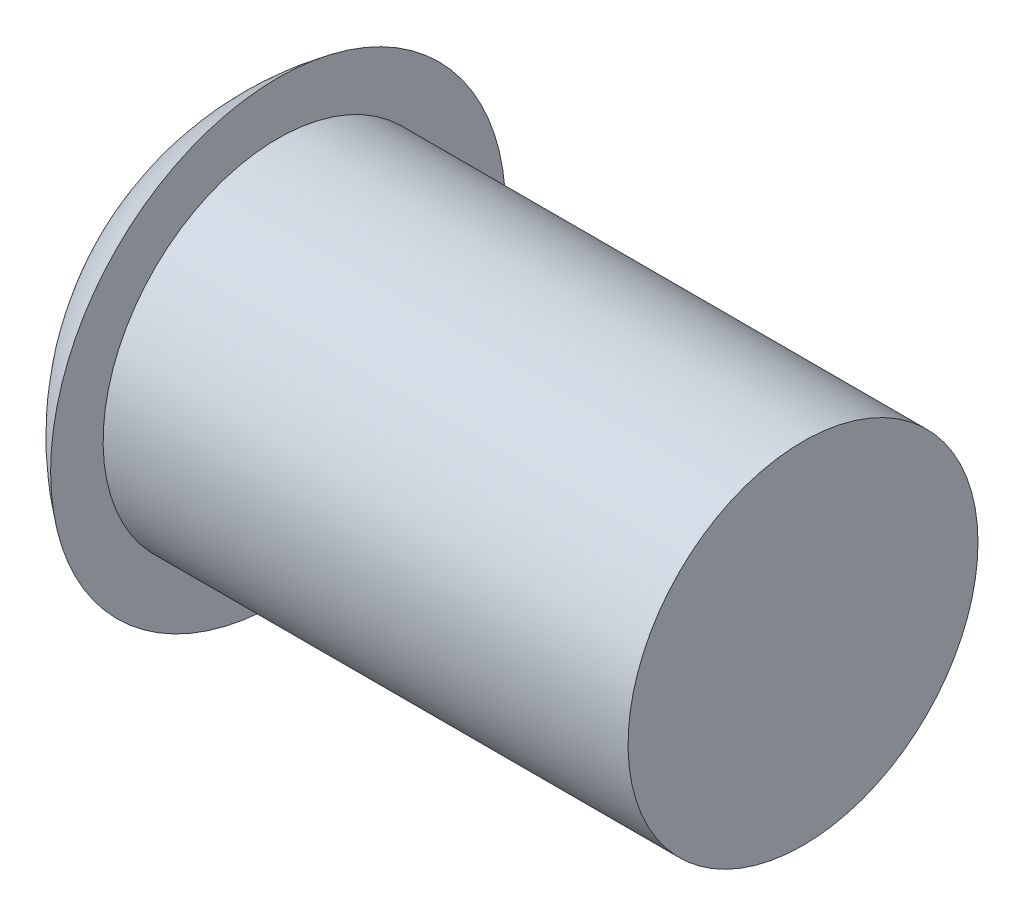
ISO-10303-21;
HEADER;
FILE_DESCRIPTION(('STEP AP214'),'2;1');
FILE_NAME('part.step','',(''),(''),'','','');
FILE_SCHEMA(('AUTOMOTIVE_DESIGN { 1 0 10303 214 1 1 1 1 }'));
ENDSEC;
DATA;
#1=APPLICATION_CONTEXT('core data for automotive mechanical design processes');
#2=APPLICATION_PROTOCOL_DEFINITION('international standard','automotive_design',2000,#1);
#3=PRODUCT_CONTEXT('',#1,'mechanical');
#4=PRODUCT('Part','Part','',(#3));
#5=PRODUCT_RELATED_PRODUCT_CATEGORY('part','',(#4));
#6=PRODUCT_DEFINITION_FORMATION('','',#4);
#7=PRODUCT_DEFINITION_CONTEXT('part definition',#1,'design');
#8=PRODUCT_DEFINITION('design','',#6,#7);
#9=PRODUCT_DEFINITION_SHAPE('','',#8);
#10=(LENGTH_UNIT() NAMED_UNIT(*) SI_UNIT(.MILLI.,.METRE.));
#11=(NAMED_UNIT(*) PLANE_ANGLE_UNIT() SI_UNIT($,.RADIAN.));
#12=(NAMED_UNIT(*) SI_UNIT($,.STERADIAN.) SOLID_ANGLE_UNIT());
#13=UNCERTAINTY_MEASURE_WITH_UNIT(LENGTH_MEASURE(1.E-05),#10,'distance_accuracy_value','');
#14=(GEOMETRIC_REPRESENTATION_CONTEXT(3) GLOBAL_UNCERTAINTY_ASSIGNED_CONTEXT((#13)) GLOBAL_UNIT_ASSIGNED_CONTEXT((#10,
#11,#12)) REPRESENTATION_CONTEXT('',''));
#15=CARTESIAN_POINT('',(0.,0.,0.));
#16=DIRECTION('',(0.,0.,1.));
#17=DIRECTION('',(1.,0.,0.));
#18=AXIS2_PLACEMENT_3D('',#15,#16,#17);
#19=CARTESIAN_POINT('',(15.,0.,0.));
#20=DIRECTION('',(-1.,0.,0.));
#21=DIRECTION('',(0.,0.,1.));
#22=AXIS2_PLACEMENT_3D('',#19,#20,#21);
#23=CYLINDRICAL_SURFACE('',#22,5.);
#24=CARTESIAN_POINT('',(15.,0.,0.));
#25=DIRECTION('',(1.,0.,0.));
#26=DIRECTION('',(0.,0.,-1.));
#27=AXIS2_PLACEMENT_3D('',#24,#25,#26);
#28=CIRCLE('',#27,5.);
#29=CARTESIAN_POINT('',(15.,0.,-5.));
#30=VERTEX_POINT('',#29);
#31=EDGE_CURVE('E10',#30,#30,#28,.T.);
#32=ORIENTED_EDGE('',*,*,#31,.F.);
#33=EDGE_LOOP('',(#32));
#34=FACE_BOUND('',#33,.T.);
#35=CARTESIAN_POINT('',(0.,0.,0.));
#36=DIRECTION('',(-1.,0.,0.));
#37=DIRECTION('',(0.,-1.,0.));
#38=AXIS2_PLACEMENT_3D('',#35,#36,#37);
#39=CIRCLE('',#38,5.);
#40=CARTESIAN_POINT('',(0.,-5.,0.));
#41=VERTEX_POINT('',#40);
#42=EDGE_CURVE('E37',#41,#41,#39,.T.);
#43=ORIENTED_EDGE('',*,*,#42,.F.);
#44=EDGE_LOOP('',(#43));
#45=FACE_BOUND('',#44,.T.);
#46=ADVANCED_FACE('F31',(#34,#45),#23,.T.);
#47=CARTESIAN_POINT('',(15.,0.,0.));
#48=DIRECTION('',(1.,0.,0.));
#49=DIRECTION('',(0.,0.,-1.));
#50=AXIS2_PLACEMENT_3D('',#47,#48,#49);
#51=PLANE('',#50);
#52=ORIENTED_EDGE('',*,*,#31,.T.);
#53=EDGE_LOOP('',(#52));
#54=FACE_BOUND('',#53,.T.);
#55=ADVANCED_FACE('F56',(#54),#51,.T.);
#56=CARTESIAN_POINT('',(4.75151515151515,0.,0.));
#57=DIRECTION('',(-1.,0.,0.));
#58=DIRECTION('',(0.,1.,0.));
#59=AXIS2_PLACEMENT_3D('',#56,#57,#58);
#60=SPHERICAL_SURFACE('',#59,8.05151515151515);
#61=CARTESIAN_POINT('',(0.,0.,0.));
#62=DIRECTION('',(-1.,0.,0.));
#63=DIRECTION('',(0.,-1.,0.));
#64=AXIS2_PLACEMENT_3D('',#61,#62,#63);
#65=CIRCLE('',#64,6.5);
#66=CARTESIAN_POINT('',(0.,-6.5,0.));
#67=VERTEX_POINT('',#66);
#68=EDGE_CURVE('E41',#67,#67,#65,.T.);
#69=ORIENTED_EDGE('',*,*,#68,.T.);
#70=EDGE_LOOP('',(#69));
#71=FACE_BOUND('',#70,.T.);
#72=ADVANCED_FACE('F48',(#71),#60,.T.);
#73=CARTESIAN_POINT('',(0.,0.,0.));
#74=DIRECTION('',(-1.,0.,0.));
#75=DIRECTION('',(0.,-1.,0.));
#76=AXIS2_PLACEMENT_3D('',#73,#74,#75);
#77=PLANE('',#76);
#78=ORIENTED_EDGE('',*,*,#42,.T.);
#79=EDGE_LOOP('',(#78));
#80=FACE_BOUND('',#79,.T.);
#81=ORIENTED_EDGE('',*,*,#68,.F.);
#82=EDGE_LOOP('',(#81));
#83=FACE_BOUND('',#82,.T.);
#84=ADVANCED_FACE('F50',(#80,#83),#77,.F.);
#85=CLOSED_SHELL('',(#46,#55,#72,#84));
#86=MANIFOLD_SOLID_BREP('B2',#85);
#87=ADVANCED_BREP_SHAPE_REPRESENTATION('',(#18,#86),#14);
#88=SHAPE_DEFINITION_REPRESENTATION(#9,#87);
ENDSEC;
END-ISO-10303-21;
